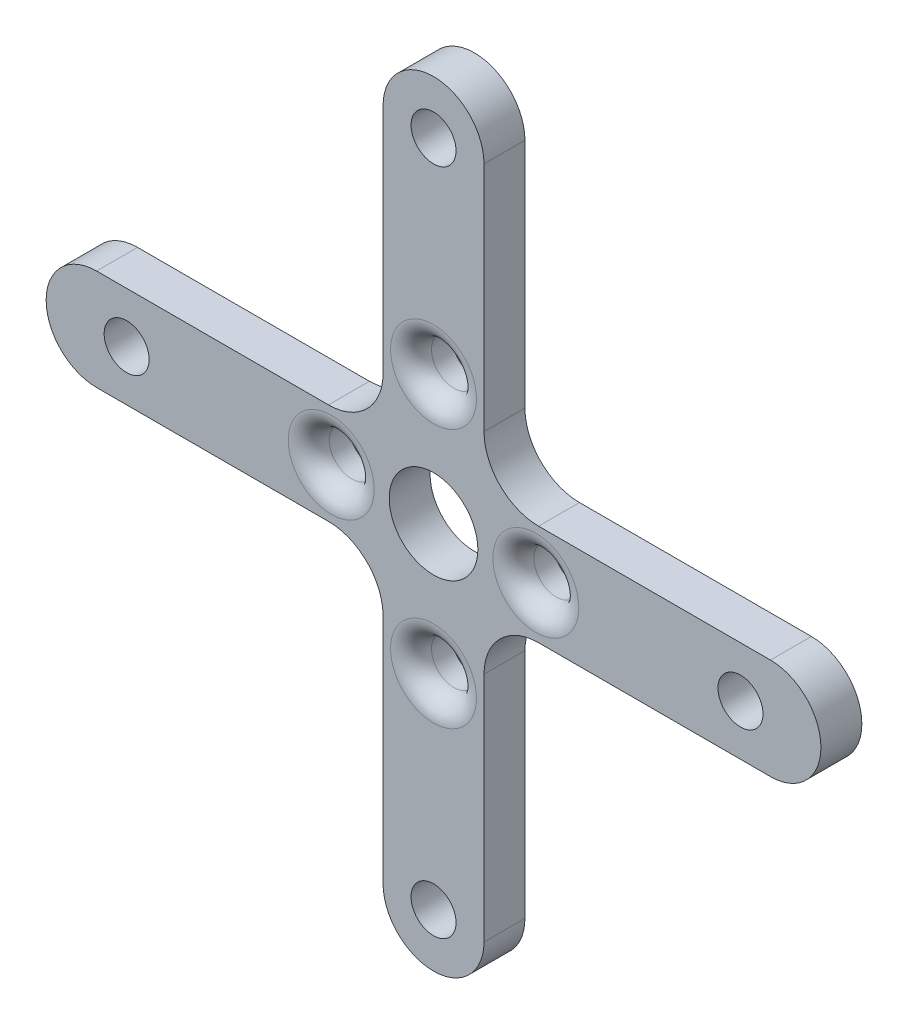
ISO-10303-21;
HEADER;
FILE_DESCRIPTION(('STEP AP214'),'2;1');
FILE_NAME('part.step','',(''),(''),'','','');
FILE_SCHEMA(('AUTOMOTIVE_DESIGN { 1 0 10303 214 1 1 1 1 }'));
ENDSEC;
DATA;
#1=APPLICATION_CONTEXT('core data for automotive mechanical design processes');
#2=APPLICATION_PROTOCOL_DEFINITION('international standard','automotive_design',2000,#1);
#3=PRODUCT_CONTEXT('',#1,'mechanical');
#4=PRODUCT('Part','Part','',(#3));
#5=PRODUCT_RELATED_PRODUCT_CATEGORY('part','',(#4));
#6=PRODUCT_DEFINITION_FORMATION('','',#4);
#7=PRODUCT_DEFINITION_CONTEXT('part definition',#1,'design');
#8=PRODUCT_DEFINITION('design','',#6,#7);
#9=PRODUCT_DEFINITION_SHAPE('','',#8);
#10=(LENGTH_UNIT() NAMED_UNIT(*) SI_UNIT(.MILLI.,.METRE.));
#11=(NAMED_UNIT(*) PLANE_ANGLE_UNIT() SI_UNIT($,.RADIAN.));
#12=(NAMED_UNIT(*) SI_UNIT($,.STERADIAN.) SOLID_ANGLE_UNIT());
#13=UNCERTAINTY_MEASURE_WITH_UNIT(LENGTH_MEASURE(1.E-05),#10,'distance_accuracy_value','');
#14=(GEOMETRIC_REPRESENTATION_CONTEXT(3) GLOBAL_UNCERTAINTY_ASSIGNED_CONTEXT((#13)) GLOBAL_UNIT_ASSIGNED_CONTEXT((#10,
#11,#12)) REPRESENTATION_CONTEXT('',''));
#15=CARTESIAN_POINT('',(0.,0.,0.));
#16=DIRECTION('',(0.,0.,1.));
#17=DIRECTION('',(1.,0.,0.));
#18=AXIS2_PLACEMENT_3D('',#15,#16,#17);
#19=CARTESIAN_POINT('',(0.,-9.5,1.5));
#20=DIRECTION('',(0.,0.,1.));
#21=DIRECTION('',(1.,0.,0.));
#22=AXIS2_PLACEMENT_3D('',#19,#20,#21);
#23=TOROIDAL_SURFACE('',#22,3.15,1.5);
#24=CARTESIAN_POINT('',(0.,-9.5,3.));
#25=DIRECTION('',(0.,0.,1.));
#26=DIRECTION('',(1.,0.,0.));
#27=AXIS2_PLACEMENT_3D('',#24,#25,#26);
#28=CIRCLE('',#27,3.15);
#29=CARTESIAN_POINT('',(3.15,-9.5,3.));
#30=VERTEX_POINT('',#29);
#31=EDGE_CURVE('E45',#30,#30,#28,.F.);
#32=ORIENTED_EDGE('',*,*,#31,.F.);
#33=EDGE_LOOP('',(#32));
#34=FACE_BOUND('',#33,.T.);
#35=CARTESIAN_POINT('',(0.,-9.5,1.5));
#36=DIRECTION('',(0.,0.,1.));
#37=DIRECTION('',(1.,0.,0.));
#38=AXIS2_PLACEMENT_3D('',#35,#36,#37);
#39=CIRCLE('',#38,1.65);
#40=CARTESIAN_POINT('',(1.65,-9.5,1.5));
#41=VERTEX_POINT('',#40);
#42=EDGE_CURVE('E11',#41,#41,#39,.T.);
#43=ORIENTED_EDGE('',*,*,#42,.F.);
#44=EDGE_LOOP('',(#43));
#45=FACE_BOUND('',#44,.T.);
#46=ADVANCED_FACE('F37',(#34,#45),#23,.T.);
#47=CARTESIAN_POINT('',(7.5,0.,1.5));
#48=DIRECTION('',(0.,0.,1.));
#49=DIRECTION('',(1.,0.,0.));
#50=AXIS2_PLACEMENT_3D('',#47,#48,#49);
#51=TOROIDAL_SURFACE('',#50,3.15,1.5);
#52=CARTESIAN_POINT('',(7.5,0.,3.));
#53=DIRECTION('',(0.,0.,1.));
#54=DIRECTION('',(1.,0.,0.));
#55=AXIS2_PLACEMENT_3D('',#52,#53,#54);
#56=CIRCLE('',#55,3.15);
#57=CARTESIAN_POINT('',(10.65,0.,3.));
#58=VERTEX_POINT('',#57);
#59=EDGE_CURVE('E269',#58,#58,#56,.F.);
#60=ORIENTED_EDGE('',*,*,#59,.F.);
#61=EDGE_LOOP('',(#60));
#62=FACE_BOUND('',#61,.T.);
#63=CARTESIAN_POINT('',(7.5,0.,1.5));
#64=DIRECTION('',(0.,0.,1.));
#65=DIRECTION('',(1.,0.,0.));
#66=AXIS2_PLACEMENT_3D('',#63,#64,#65);
#67=CIRCLE('',#66,1.65);
#68=CARTESIAN_POINT('',(9.15,0.,1.5));
#69=VERTEX_POINT('',#68);
#70=EDGE_CURVE('E272',#69,#69,#67,.T.);
#71=ORIENTED_EDGE('',*,*,#70,.F.);
#72=EDGE_LOOP('',(#71));
#73=FACE_BOUND('',#72,.T.);
#74=ADVANCED_FACE('F281',(#62,#73),#51,.T.);
#75=CARTESIAN_POINT('',(0.,9.5,1.5));
#76=DIRECTION('',(0.,0.,1.));
#77=DIRECTION('',(1.,0.,0.));
#78=AXIS2_PLACEMENT_3D('',#75,#76,#77);
#79=TOROIDAL_SURFACE('',#78,3.15,1.5);
#80=CARTESIAN_POINT('',(0.,9.5,3.));
#81=DIRECTION('',(0.,0.,1.));
#82=DIRECTION('',(1.,0.,0.));
#83=AXIS2_PLACEMENT_3D('',#80,#81,#82);
#84=CIRCLE('',#83,3.15);
#85=CARTESIAN_POINT('',(3.15,9.5,3.));
#86=VERTEX_POINT('',#85);
#87=EDGE_CURVE('E263',#86,#86,#84,.F.);
#88=ORIENTED_EDGE('',*,*,#87,.F.);
#89=EDGE_LOOP('',(#88));
#90=FACE_BOUND('',#89,.T.);
#91=CARTESIAN_POINT('',(0.,9.5,1.5));
#92=DIRECTION('',(0.,0.,1.));
#93=DIRECTION('',(1.,0.,0.));
#94=AXIS2_PLACEMENT_3D('',#91,#92,#93);
#95=CIRCLE('',#94,1.65);
#96=CARTESIAN_POINT('',(1.65,9.5,1.5));
#97=VERTEX_POINT('',#96);
#98=EDGE_CURVE('E266',#97,#97,#95,.T.);
#99=ORIENTED_EDGE('',*,*,#98,.F.);
#100=EDGE_LOOP('',(#99));
#101=FACE_BOUND('',#100,.T.);
#102=ADVANCED_FACE('F424',(#90,#101),#79,.T.);
#103=CARTESIAN_POINT('',(-7.5,0.,1.5));
#104=DIRECTION('',(0.,0.,1.));
#105=DIRECTION('',(1.,0.,0.));
#106=AXIS2_PLACEMENT_3D('',#103,#104,#105);
#107=TOROIDAL_SURFACE('',#106,3.15,1.5);
#108=CARTESIAN_POINT('',(-7.5,0.,3.));
#109=DIRECTION('',(0.,0.,1.));
#110=DIRECTION('',(1.,0.,0.));
#111=AXIS2_PLACEMENT_3D('',#108,#109,#110);
#112=CIRCLE('',#111,3.15);
#113=CARTESIAN_POINT('',(-4.35,0.,3.));
#114=VERTEX_POINT('',#113);
#115=EDGE_CURVE('E229',#114,#114,#112,.F.);
#116=ORIENTED_EDGE('',*,*,#115,.F.);
#117=EDGE_LOOP('',(#116));
#118=FACE_BOUND('',#117,.T.);
#119=CARTESIAN_POINT('',(-7.5,0.,1.5));
#120=DIRECTION('',(0.,0.,1.));
#121=DIRECTION('',(1.,0.,0.));
#122=AXIS2_PLACEMENT_3D('',#119,#120,#121);
#123=CIRCLE('',#122,1.65);
#124=CARTESIAN_POINT('',(-5.85,0.,1.5));
#125=VERTEX_POINT('',#124);
#126=EDGE_CURVE('E260',#125,#125,#123,.T.);
#127=ORIENTED_EDGE('',*,*,#126,.F.);
#128=EDGE_LOOP('',(#127));
#129=FACE_BOUND('',#128,.T.);
#130=ADVANCED_FACE('F421',(#118,#129),#107,.T.);
#131=CARTESIAN_POINT('',(7.7,-7.7,3.));
#132=DIRECTION('',(0.,0.,-1.));
#133=DIRECTION('',(-1.,0.,0.));
#134=AXIS2_PLACEMENT_3D('',#131,#132,#133);
#135=CYLINDRICAL_SURFACE('',#134,4.);
#136=CARTESIAN_POINT('',(7.7,-7.7,0.));
#137=DIRECTION('',(0.,0.,1.));
#138=DIRECTION('',(1.,0.,0.));
#139=AXIS2_PLACEMENT_3D('',#136,#137,#138);
#140=CIRCLE('',#139,4.);
#141=CARTESIAN_POINT('',(7.7,-3.7,0.));
#142=VERTEX_POINT('',#141);
#143=CARTESIAN_POINT('',(3.7,-7.7,0.));
#144=VERTEX_POINT('',#143);
#145=EDGE_CURVE('E186',#142,#144,#140,.T.);
#146=ORIENTED_EDGE('',*,*,#145,.F.);
#147=DIRECTION('',(0.,0.,-1.));
#148=VECTOR('',#147,1.);
#149=CARTESIAN_POINT('',(7.7,-3.7,3.));
#150=LINE('',#149,#148);
#151=CARTESIAN_POINT('',(7.7,-3.7,3.));
#152=VERTEX_POINT('',#151);
#153=EDGE_CURVE('E53',#152,#142,#150,.T.);
#154=ORIENTED_EDGE('',*,*,#153,.F.);
#155=CARTESIAN_POINT('',(7.7,-7.7,3.));
#156=DIRECTION('',(0.,0.,1.));
#157=DIRECTION('',(1.,0.,0.));
#158=AXIS2_PLACEMENT_3D('',#155,#156,#157);
#159=CIRCLE('',#158,4.);
#160=CARTESIAN_POINT('',(3.7,-7.7,3.));
#161=VERTEX_POINT('',#160);
#162=EDGE_CURVE('E227',#152,#161,#159,.T.);
#163=ORIENTED_EDGE('',*,*,#162,.T.);
#164=DIRECTION('',(0.,0.,-1.));
#165=VECTOR('',#164,1.);
#166=CARTESIAN_POINT('',(3.7,-7.7,3.));
#167=LINE('',#166,#165);
#168=EDGE_CURVE('E115',#161,#144,#167,.T.);
#169=ORIENTED_EDGE('',*,*,#168,.T.);
#170=EDGE_LOOP('',(#146,#154,#163,#169));
#171=FACE_BOUND('',#170,.T.);
#172=ADVANCED_FACE('F382',(#171),#135,.F.);
#173=CARTESIAN_POINT('',(7.7,-3.7,3.));
#174=DIRECTION('',(0.,1.,0.));
#175=DIRECTION('',(0.,0.,1.));
#176=AXIS2_PLACEMENT_3D('',#173,#174,#175);
#177=PLANE('',#176);
#178=DIRECTION('',(1.,0.,0.));
#179=VECTOR('',#178,1.);
#180=CARTESIAN_POINT('',(7.7,-3.7,0.));
#181=LINE('',#180,#179);
#182=CARTESIAN_POINT('',(24.7,-3.7,0.));
#183=VERTEX_POINT('',#182);
#184=EDGE_CURVE('E106',#142,#183,#181,.T.);
#185=ORIENTED_EDGE('',*,*,#184,.T.);
#186=DIRECTION('',(0.,0.,-1.));
#187=VECTOR('',#186,1.);
#188=CARTESIAN_POINT('',(24.7,-3.7,3.));
#189=LINE('',#188,#187);
#190=CARTESIAN_POINT('',(24.7,-3.7,3.));
#191=VERTEX_POINT('',#190);
#192=EDGE_CURVE('E175',#191,#183,#189,.T.);
#193=ORIENTED_EDGE('',*,*,#192,.F.);
#194=DIRECTION('',(1.,0.,0.));
#195=VECTOR('',#194,1.);
#196=CARTESIAN_POINT('',(7.7,-3.7,3.));
#197=LINE('',#196,#195);
#198=EDGE_CURVE('E164',#152,#191,#197,.T.);
#199=ORIENTED_EDGE('',*,*,#198,.F.);
#200=ORIENTED_EDGE('',*,*,#153,.T.);
#201=EDGE_LOOP('',(#185,#193,#199,#200));
#202=FACE_BOUND('',#201,.T.);
#203=ADVANCED_FACE('F420',(#202),#177,.F.);
#204=CARTESIAN_POINT('',(24.7,0.,3.));
#205=DIRECTION('',(0.,0.,-1.));
#206=DIRECTION('',(-1.,0.,0.));
#207=AXIS2_PLACEMENT_3D('',#204,#205,#206);
#208=CYLINDRICAL_SURFACE('',#207,3.7);
#209=CARTESIAN_POINT('',(24.7,0.,0.));
#210=DIRECTION('',(0.,0.,1.));
#211=DIRECTION('',(1.,0.,0.));
#212=AXIS2_PLACEMENT_3D('',#209,#210,#211);
#213=CIRCLE('',#212,3.7);
#214=CARTESIAN_POINT('',(24.7,3.7,0.));
#215=VERTEX_POINT('',#214);
#216=EDGE_CURVE('E171',#183,#215,#213,.T.);
#217=ORIENTED_EDGE('',*,*,#216,.T.);
#218=DIRECTION('',(0.,0.,-1.));
#219=VECTOR('',#218,1.);
#220=CARTESIAN_POINT('',(24.7,3.7,3.));
#221=LINE('',#220,#219);
#222=CARTESIAN_POINT('',(24.7,3.7,3.));
#223=VERTEX_POINT('',#222);
#224=EDGE_CURVE('E168',#223,#215,#221,.T.);
#225=ORIENTED_EDGE('',*,*,#224,.F.);
#226=CARTESIAN_POINT('',(24.7,0.,3.));
#227=DIRECTION('',(0.,0.,1.));
#228=DIRECTION('',(1.,0.,0.));
#229=AXIS2_PLACEMENT_3D('',#226,#227,#228);
#230=CIRCLE('',#229,3.7);
#231=EDGE_CURVE('E156',#191,#223,#230,.T.);
#232=ORIENTED_EDGE('',*,*,#231,.F.);
#233=ORIENTED_EDGE('',*,*,#192,.T.);
#234=EDGE_LOOP('',(#217,#225,#232,#233));
#235=FACE_BOUND('',#234,.T.);
#236=ADVANCED_FACE('F169',(#235),#208,.T.);
#237=CARTESIAN_POINT('',(7.7,3.7,3.));
#238=DIRECTION('',(0.,1.,0.));
#239=DIRECTION('',(0.,0.,1.));
#240=AXIS2_PLACEMENT_3D('',#237,#238,#239);
#241=PLANE('',#240);
#242=DIRECTION('',(1.,0.,0.));
#243=VECTOR('',#242,1.);
#244=CARTESIAN_POINT('',(7.7,3.7,0.));
#245=LINE('',#244,#243);
#246=CARTESIAN_POINT('',(7.7,3.7,0.));
#247=VERTEX_POINT('',#246);
#248=EDGE_CURVE('E223',#247,#215,#245,.T.);
#249=ORIENTED_EDGE('',*,*,#248,.F.);
#250=DIRECTION('',(0.,0.,-1.));
#251=VECTOR('',#250,1.);
#252=CARTESIAN_POINT('',(7.7,3.7,3.));
#253=LINE('',#252,#251);
#254=CARTESIAN_POINT('',(7.7,3.7,3.));
#255=VERTEX_POINT('',#254);
#256=EDGE_CURVE('E176',#255,#247,#253,.T.);
#257=ORIENTED_EDGE('',*,*,#256,.F.);
#258=DIRECTION('',(1.,0.,0.));
#259=VECTOR('',#258,1.);
#260=CARTESIAN_POINT('',(7.7,3.7,3.));
#261=LINE('',#260,#259);
#262=EDGE_CURVE('E162',#255,#223,#261,.T.);
#263=ORIENTED_EDGE('',*,*,#262,.T.);
#264=ORIENTED_EDGE('',*,*,#224,.T.);
#265=EDGE_LOOP('',(#249,#257,#263,#264));
#266=FACE_BOUND('',#265,.T.);
#267=ADVANCED_FACE('F178',(#266),#241,.T.);
#268=CARTESIAN_POINT('',(7.7,7.7,3.));
#269=DIRECTION('',(0.,0.,-1.));
#270=DIRECTION('',(-1.,0.,0.));
#271=AXIS2_PLACEMENT_3D('',#268,#269,#270);
#272=CYLINDRICAL_SURFACE('',#271,4.);
#273=CARTESIAN_POINT('',(7.7,7.7,0.));
#274=DIRECTION('',(0.,0.,1.));
#275=DIRECTION('',(1.,0.,0.));
#276=AXIS2_PLACEMENT_3D('',#273,#274,#275);
#277=CIRCLE('',#276,4.);
#278=CARTESIAN_POINT('',(3.7,7.7,0.));
#279=VERTEX_POINT('',#278);
#280=EDGE_CURVE('E220',#279,#247,#277,.T.);
#281=ORIENTED_EDGE('',*,*,#280,.F.);
#282=DIRECTION('',(0.,0.,-1.));
#283=VECTOR('',#282,1.);
#284=CARTESIAN_POINT('',(3.7,7.7,3.));
#285=LINE('',#284,#283);
#286=CARTESIAN_POINT('',(3.7,7.7,3.));
#287=VERTEX_POINT('',#286);
#288=EDGE_CURVE('E232',#287,#279,#285,.T.);
#289=ORIENTED_EDGE('',*,*,#288,.F.);
#290=CARTESIAN_POINT('',(7.7,7.7,3.));
#291=DIRECTION('',(0.,0.,1.));
#292=DIRECTION('',(1.,0.,0.));
#293=AXIS2_PLACEMENT_3D('',#290,#291,#292);
#294=CIRCLE('',#293,4.);
#295=EDGE_CURVE('E179',#287,#255,#294,.T.);
#296=ORIENTED_EDGE('',*,*,#295,.T.);
#297=ORIENTED_EDGE('',*,*,#256,.T.);
#298=EDGE_LOOP('',(#281,#289,#296,#297));
#299=FACE_BOUND('',#298,.T.);
#300=ADVANCED_FACE('F387',(#299),#272,.F.);
#301=CARTESIAN_POINT('',(3.7,7.7,3.));
#302=DIRECTION('',(-1.,0.,0.));
#303=DIRECTION('',(0.,0.,1.));
#304=AXIS2_PLACEMENT_3D('',#301,#302,#303);
#305=PLANE('',#304);
#306=DIRECTION('',(0.,1.,0.));
#307=VECTOR('',#306,1.);
#308=CARTESIAN_POINT('',(3.7,7.7,0.));
#309=LINE('',#308,#307);
#310=CARTESIAN_POINT('',(3.7,24.7,0.));
#311=VERTEX_POINT('',#310);
#312=EDGE_CURVE('E218',#279,#311,#309,.T.);
#313=ORIENTED_EDGE('',*,*,#312,.T.);
#314=DIRECTION('',(0.,0.,-1.));
#315=VECTOR('',#314,1.);
#316=CARTESIAN_POINT('',(3.7,24.7,3.));
#317=LINE('',#316,#315);
#318=CARTESIAN_POINT('',(3.7,24.7,3.));
#319=VERTEX_POINT('',#318);
#320=EDGE_CURVE('E234',#319,#311,#317,.T.);
#321=ORIENTED_EDGE('',*,*,#320,.F.);
#322=DIRECTION('',(0.,1.,0.));
#323=VECTOR('',#322,1.);
#324=CARTESIAN_POINT('',(3.7,7.7,3.));
#325=LINE('',#324,#323);
#326=EDGE_CURVE('E181',#287,#319,#325,.T.);
#327=ORIENTED_EDGE('',*,*,#326,.F.);
#328=ORIENTED_EDGE('',*,*,#288,.T.);
#329=EDGE_LOOP('',(#313,#321,#327,#328));
#330=FACE_BOUND('',#329,.T.);
#331=ADVANCED_FACE('F341',(#330),#305,.F.);
#332=CARTESIAN_POINT('',(0.,24.7,3.));
#333=DIRECTION('',(0.,0.,-1.));
#334=DIRECTION('',(-1.,0.,0.));
#335=AXIS2_PLACEMENT_3D('',#332,#333,#334);
#336=CYLINDRICAL_SURFACE('',#335,3.7);
#337=CARTESIAN_POINT('',(0.,24.7,0.));
#338=DIRECTION('',(0.,0.,1.));
#339=DIRECTION('',(1.,0.,0.));
#340=AXIS2_PLACEMENT_3D('',#337,#338,#339);
#341=CIRCLE('',#340,3.7);
#342=CARTESIAN_POINT('',(-3.7,24.7,0.));
#343=VERTEX_POINT('',#342);
#344=EDGE_CURVE('E215',#311,#343,#341,.T.);
#345=ORIENTED_EDGE('',*,*,#344,.T.);
#346=DIRECTION('',(0.,0.,-1.));
#347=VECTOR('',#346,1.);
#348=CARTESIAN_POINT('',(-3.7,24.7,3.));
#349=LINE('',#348,#347);
#350=CARTESIAN_POINT('',(-3.7,24.7,3.));
#351=VERTEX_POINT('',#350);
#352=EDGE_CURVE('E237',#351,#343,#349,.T.);
#353=ORIENTED_EDGE('',*,*,#352,.F.);
#354=CARTESIAN_POINT('',(0.,24.7,3.));
#355=DIRECTION('',(0.,0.,1.));
#356=DIRECTION('',(1.,0.,0.));
#357=AXIS2_PLACEMENT_3D('',#354,#355,#356);
#358=CIRCLE('',#357,3.7);
#359=EDGE_CURVE('E334',#319,#351,#358,.T.);
#360=ORIENTED_EDGE('',*,*,#359,.F.);
#361=ORIENTED_EDGE('',*,*,#320,.T.);
#362=EDGE_LOOP('',(#345,#353,#360,#361));
#363=FACE_BOUND('',#362,.T.);
#364=ADVANCED_FACE('F345',(#363),#336,.T.);
#365=CARTESIAN_POINT('',(-3.7,7.7,3.));
#366=DIRECTION('',(-1.,0.,0.));
#367=DIRECTION('',(0.,0.,1.));
#368=AXIS2_PLACEMENT_3D('',#365,#366,#367);
#369=PLANE('',#368);
#370=DIRECTION('',(0.,1.,0.));
#371=VECTOR('',#370,1.);
#372=CARTESIAN_POINT('',(-3.7,7.7,0.));
#373=LINE('',#372,#371);
#374=CARTESIAN_POINT('',(-3.7,7.7,0.));
#375=VERTEX_POINT('',#374);
#376=EDGE_CURVE('E212',#375,#343,#373,.T.);
#377=ORIENTED_EDGE('',*,*,#376,.F.);
#378=DIRECTION('',(0.,0.,-1.));
#379=VECTOR('',#378,1.);
#380=CARTESIAN_POINT('',(-3.7,7.7,3.));
#381=LINE('',#380,#379);
#382=CARTESIAN_POINT('',(-3.7,7.7,3.));
#383=VERTEX_POINT('',#382);
#384=EDGE_CURVE('E239',#383,#375,#381,.T.);
#385=ORIENTED_EDGE('',*,*,#384,.F.);
#386=DIRECTION('',(0.,1.,0.));
#387=VECTOR('',#386,1.);
#388=CARTESIAN_POINT('',(-3.7,7.7,3.));
#389=LINE('',#388,#387);
#390=EDGE_CURVE('E331',#383,#351,#389,.T.);
#391=ORIENTED_EDGE('',*,*,#390,.T.);
#392=ORIENTED_EDGE('',*,*,#352,.T.);
#393=EDGE_LOOP('',(#377,#385,#391,#392));
#394=FACE_BOUND('',#393,.T.);
#395=ADVANCED_FACE('F348',(#394),#369,.T.);
#396=CARTESIAN_POINT('',(-7.7,7.7,3.));
#397=DIRECTION('',(0.,0.,-1.));
#398=DIRECTION('',(-1.,0.,0.));
#399=AXIS2_PLACEMENT_3D('',#396,#397,#398);
#400=CYLINDRICAL_SURFACE('',#399,4.);
#401=CARTESIAN_POINT('',(-7.7,7.7,0.));
#402=DIRECTION('',(0.,0.,1.));
#403=DIRECTION('',(1.,0.,0.));
#404=AXIS2_PLACEMENT_3D('',#401,#402,#403);
#405=CIRCLE('',#404,4.);
#406=CARTESIAN_POINT('',(-7.7,3.7,0.));
#407=VERTEX_POINT('',#406);
#408=EDGE_CURVE('E209',#407,#375,#405,.T.);
#409=ORIENTED_EDGE('',*,*,#408,.F.);
#410=DIRECTION('',(0.,0.,-1.));
#411=VECTOR('',#410,1.);
#412=CARTESIAN_POINT('',(-7.7,3.7,3.));
#413=LINE('',#412,#411);
#414=CARTESIAN_POINT('',(-7.7,3.7,3.));
#415=VERTEX_POINT('',#414);
#416=EDGE_CURVE('E241',#415,#407,#413,.T.);
#417=ORIENTED_EDGE('',*,*,#416,.F.);
#418=CARTESIAN_POINT('',(-7.7,7.7,3.));
#419=DIRECTION('',(0.,0.,1.));
#420=DIRECTION('',(1.,0.,0.));
#421=AXIS2_PLACEMENT_3D('',#418,#419,#420);
#422=CIRCLE('',#421,4.);
#423=EDGE_CURVE('E328',#415,#383,#422,.T.);
#424=ORIENTED_EDGE('',*,*,#423,.T.);
#425=ORIENTED_EDGE('',*,*,#384,.T.);
#426=EDGE_LOOP('',(#409,#417,#424,#425));
#427=FACE_BOUND('',#426,.T.);
#428=ADVANCED_FACE('F352',(#427),#400,.F.);
#429=CARTESIAN_POINT('',(-7.7,3.7,3.));
#430=DIRECTION('',(0.,-1.,0.));
#431=DIRECTION('',(1.,0.,0.));
#432=AXIS2_PLACEMENT_3D('',#429,#430,#431);
#433=PLANE('',#432);
#434=DIRECTION('',(-1.,0.,0.));
#435=VECTOR('',#434,1.);
#436=CARTESIAN_POINT('',(-7.7,3.7,0.));
#437=LINE('',#436,#435);
#438=CARTESIAN_POINT('',(-24.7,3.7,0.));
#439=VERTEX_POINT('',#438);
#440=EDGE_CURVE('E207',#407,#439,#437,.T.);
#441=ORIENTED_EDGE('',*,*,#440,.T.);
#442=DIRECTION('',(0.,0.,-1.));
#443=VECTOR('',#442,1.);
#444=CARTESIAN_POINT('',(-24.7,3.7,3.));
#445=LINE('',#444,#443);
#446=CARTESIAN_POINT('',(-24.7,3.7,3.));
#447=VERTEX_POINT('',#446);
#448=EDGE_CURVE('E243',#447,#439,#445,.T.);
#449=ORIENTED_EDGE('',*,*,#448,.F.);
#450=DIRECTION('',(-1.,0.,0.));
#451=VECTOR('',#450,1.);
#452=CARTESIAN_POINT('',(-7.7,3.7,3.));
#453=LINE('',#452,#451);
#454=EDGE_CURVE('E326',#415,#447,#453,.T.);
#455=ORIENTED_EDGE('',*,*,#454,.F.);
#456=ORIENTED_EDGE('',*,*,#416,.T.);
#457=EDGE_LOOP('',(#441,#449,#455,#456));
#458=FACE_BOUND('',#457,.T.);
#459=ADVANCED_FACE('F357',(#458),#433,.F.);
#460=CARTESIAN_POINT('',(-24.7,0.,3.));
#461=DIRECTION('',(0.,0.,-1.));
#462=DIRECTION('',(-1.,0.,0.));
#463=AXIS2_PLACEMENT_3D('',#460,#461,#462);
#464=CYLINDRICAL_SURFACE('',#463,3.7);
#465=CARTESIAN_POINT('',(-24.7,0.,0.));
#466=DIRECTION('',(0.,0.,1.));
#467=DIRECTION('',(1.,0.,0.));
#468=AXIS2_PLACEMENT_3D('',#465,#466,#467);
#469=CIRCLE('',#468,3.7);
#470=CARTESIAN_POINT('',(-24.7,-3.7,0.));
#471=VERTEX_POINT('',#470);
#472=EDGE_CURVE('E204',#439,#471,#469,.T.);
#473=ORIENTED_EDGE('',*,*,#472,.T.);
#474=DIRECTION('',(0.,0.,-1.));
#475=VECTOR('',#474,1.);
#476=CARTESIAN_POINT('',(-24.7,-3.7,3.));
#477=LINE('',#476,#475);
#478=CARTESIAN_POINT('',(-24.7,-3.7,3.));
#479=VERTEX_POINT('',#478);
#480=EDGE_CURVE('E246',#479,#471,#477,.T.);
#481=ORIENTED_EDGE('',*,*,#480,.F.);
#482=CARTESIAN_POINT('',(-24.7,0.,3.));
#483=DIRECTION('',(0.,0.,1.));
#484=DIRECTION('',(1.,0.,0.));
#485=AXIS2_PLACEMENT_3D('',#482,#483,#484);
#486=CIRCLE('',#485,3.7);
#487=EDGE_CURVE('E324',#447,#479,#486,.T.);
#488=ORIENTED_EDGE('',*,*,#487,.F.);
#489=ORIENTED_EDGE('',*,*,#448,.T.);
#490=EDGE_LOOP('',(#473,#481,#488,#489));
#491=FACE_BOUND('',#490,.T.);
#492=ADVANCED_FACE('F363',(#491),#464,.T.);
#493=CARTESIAN_POINT('',(-7.7,-3.7,3.));
#494=DIRECTION('',(0.,-1.,0.));
#495=DIRECTION('',(0.,0.,-1.));
#496=AXIS2_PLACEMENT_3D('',#493,#494,#495);
#497=PLANE('',#496);
#498=DIRECTION('',(-1.,0.,0.));
#499=VECTOR('',#498,1.);
#500=CARTESIAN_POINT('',(-7.7,-3.7,0.));
#501=LINE('',#500,#499);
#502=CARTESIAN_POINT('',(-7.7,-3.7,0.));
#503=VERTEX_POINT('',#502);
#504=EDGE_CURVE('E201',#503,#471,#501,.T.);
#505=ORIENTED_EDGE('',*,*,#504,.F.);
#506=DIRECTION('',(0.,0.,-1.));
#507=VECTOR('',#506,1.);
#508=CARTESIAN_POINT('',(-7.7,-3.7,3.));
#509=LINE('',#508,#507);
#510=CARTESIAN_POINT('',(-7.7,-3.7,3.));
#511=VERTEX_POINT('',#510);
#512=EDGE_CURVE('E248',#511,#503,#509,.T.);
#513=ORIENTED_EDGE('',*,*,#512,.F.);
#514=DIRECTION('',(-1.,0.,0.));
#515=VECTOR('',#514,1.);
#516=CARTESIAN_POINT('',(-7.7,-3.7,3.));
#517=LINE('',#516,#515);
#518=EDGE_CURVE('E321',#511,#479,#517,.T.);
#519=ORIENTED_EDGE('',*,*,#518,.T.);
#520=ORIENTED_EDGE('',*,*,#480,.T.);
#521=EDGE_LOOP('',(#505,#513,#519,#520));
#522=FACE_BOUND('',#521,.T.);
#523=ADVANCED_FACE('F367',(#522),#497,.T.);
#524=CARTESIAN_POINT('',(-7.7,-7.7,3.));
#525=DIRECTION('',(0.,0.,-1.));
#526=DIRECTION('',(-1.,0.,0.));
#527=AXIS2_PLACEMENT_3D('',#524,#525,#526);
#528=CYLINDRICAL_SURFACE('',#527,4.);
#529=CARTESIAN_POINT('',(-7.7,-7.7,0.));
#530=DIRECTION('',(0.,0.,1.));
#531=DIRECTION('',(1.,0.,0.));
#532=AXIS2_PLACEMENT_3D('',#529,#530,#531);
#533=CIRCLE('',#532,4.);
#534=CARTESIAN_POINT('',(-3.7,-7.7,0.));
#535=VERTEX_POINT('',#534);
#536=EDGE_CURVE('E198',#535,#503,#533,.T.);
#537=ORIENTED_EDGE('',*,*,#536,.F.);
#538=DIRECTION('',(0.,0.,-1.));
#539=VECTOR('',#538,1.);
#540=CARTESIAN_POINT('',(-3.7,-7.7,3.));
#541=LINE('',#540,#539);
#542=CARTESIAN_POINT('',(-3.7,-7.7,3.));
#543=VERTEX_POINT('',#542);
#544=EDGE_CURVE('E250',#543,#535,#541,.T.);
#545=ORIENTED_EDGE('',*,*,#544,.F.);
#546=CARTESIAN_POINT('',(-7.7,-7.7,3.));
#547=DIRECTION('',(0.,0.,1.));
#548=DIRECTION('',(1.,0.,0.));
#549=AXIS2_PLACEMENT_3D('',#546,#547,#548);
#550=CIRCLE('',#549,4.);
#551=EDGE_CURVE('E318',#543,#511,#550,.T.);
#552=ORIENTED_EDGE('',*,*,#551,.T.);
#553=ORIENTED_EDGE('',*,*,#512,.T.);
#554=EDGE_LOOP('',(#537,#545,#552,#553));
#555=FACE_BOUND('',#554,.T.);
#556=ADVANCED_FACE('F370',(#555),#528,.F.);
#557=CARTESIAN_POINT('',(-3.7,-7.7,3.));
#558=DIRECTION('',(1.,0.,0.));
#559=DIRECTION('',(0.,1.,0.));
#560=AXIS2_PLACEMENT_3D('',#557,#558,#559);
#561=PLANE('',#560);
#562=DIRECTION('',(0.,-1.,0.));
#563=VECTOR('',#562,1.);
#564=CARTESIAN_POINT('',(-3.7,-7.7,0.));
#565=LINE('',#564,#563);
#566=CARTESIAN_POINT('',(-3.7,-24.7,0.));
#567=VERTEX_POINT('',#566);
#568=EDGE_CURVE('E196',#535,#567,#565,.T.);
#569=ORIENTED_EDGE('',*,*,#568,.T.);
#570=DIRECTION('',(0.,0.,-1.));
#571=VECTOR('',#570,1.);
#572=CARTESIAN_POINT('',(-3.7,-24.7,3.));
#573=LINE('',#572,#571);
#574=CARTESIAN_POINT('',(-3.7,-24.7,3.));
#575=VERTEX_POINT('',#574);
#576=EDGE_CURVE('E252',#575,#567,#573,.T.);
#577=ORIENTED_EDGE('',*,*,#576,.F.);
#578=DIRECTION('',(0.,-1.,0.));
#579=VECTOR('',#578,1.);
#580=CARTESIAN_POINT('',(-3.7,-7.7,3.));
#581=LINE('',#580,#579);
#582=EDGE_CURVE('E316',#543,#575,#581,.T.);
#583=ORIENTED_EDGE('',*,*,#582,.F.);
#584=ORIENTED_EDGE('',*,*,#544,.T.);
#585=EDGE_LOOP('',(#569,#577,#583,#584));
#586=FACE_BOUND('',#585,.T.);
#587=ADVANCED_FACE('F376',(#586),#561,.F.);
#588=CARTESIAN_POINT('',(0.,-24.7,3.));
#589=DIRECTION('',(0.,0.,-1.));
#590=DIRECTION('',(-1.,0.,0.));
#591=AXIS2_PLACEMENT_3D('',#588,#589,#590);
#592=CYLINDRICAL_SURFACE('',#591,3.7);
#593=CARTESIAN_POINT('',(0.,-24.7,0.));
#594=DIRECTION('',(0.,0.,1.));
#595=DIRECTION('',(1.,0.,0.));
#596=AXIS2_PLACEMENT_3D('',#593,#594,#595);
#597=CIRCLE('',#596,3.7);
#598=CARTESIAN_POINT('',(3.7,-24.7,0.));
#599=VERTEX_POINT('',#598);
#600=EDGE_CURVE('E193',#567,#599,#597,.T.);
#601=ORIENTED_EDGE('',*,*,#600,.T.);
#602=DIRECTION('',(0.,0.,-1.));
#603=VECTOR('',#602,1.);
#604=CARTESIAN_POINT('',(3.7,-24.7,3.));
#605=LINE('',#604,#603);
#606=CARTESIAN_POINT('',(3.7,-24.7,3.));
#607=VERTEX_POINT('',#606);
#608=EDGE_CURVE('E255',#607,#599,#605,.T.);
#609=ORIENTED_EDGE('',*,*,#608,.F.);
#610=CARTESIAN_POINT('',(0.,-24.7,3.));
#611=DIRECTION('',(0.,0.,1.));
#612=DIRECTION('',(1.,0.,0.));
#613=AXIS2_PLACEMENT_3D('',#610,#611,#612);
#614=CIRCLE('',#613,3.7);
#615=EDGE_CURVE('E314',#575,#607,#614,.T.);
#616=ORIENTED_EDGE('',*,*,#615,.F.);
#617=ORIENTED_EDGE('',*,*,#576,.T.);
#618=EDGE_LOOP('',(#601,#609,#616,#617));
#619=FACE_BOUND('',#618,.T.);
#620=ADVANCED_FACE('F380',(#619),#592,.T.);
#621=CARTESIAN_POINT('',(3.7,-7.7,3.));
#622=DIRECTION('',(1.,0.,0.));
#623=DIRECTION('',(0.,0.,-1.));
#624=AXIS2_PLACEMENT_3D('',#621,#622,#623);
#625=PLANE('',#624);
#626=DIRECTION('',(0.,-1.,0.));
#627=VECTOR('',#626,1.);
#628=CARTESIAN_POINT('',(3.7,-7.7,0.));
#629=LINE('',#628,#627);
#630=EDGE_CURVE('E189',#144,#599,#629,.T.);
#631=ORIENTED_EDGE('',*,*,#630,.F.);
#632=ORIENTED_EDGE('',*,*,#168,.F.);
#633=DIRECTION('',(0.,-1.,0.));
#634=VECTOR('',#633,1.);
#635=CARTESIAN_POINT('',(3.7,-7.7,3.));
#636=LINE('',#635,#634);
#637=EDGE_CURVE('E312',#161,#607,#636,.T.);
#638=ORIENTED_EDGE('',*,*,#637,.T.);
#639=ORIENTED_EDGE('',*,*,#608,.T.);
#640=EDGE_LOOP('',(#631,#632,#638,#639));
#641=FACE_BOUND('',#640,.T.);
#642=ADVANCED_FACE('F381',(#641),#625,.T.);
#643=CARTESIAN_POINT('',(7.7,-7.7,3.));
#644=DIRECTION('',(0.,0.,1.));
#645=DIRECTION('',(1.,0.,0.));
#646=AXIS2_PLACEMENT_3D('',#643,#644,#645);
#647=PLANE('',#646);
#648=ORIENTED_EDGE('',*,*,#31,.T.);
#649=EDGE_LOOP('',(#648));
#650=FACE_BOUND('',#649,.T.);
#651=ORIENTED_EDGE('',*,*,#59,.T.);
#652=EDGE_LOOP('',(#651));
#653=FACE_BOUND('',#652,.T.);
#654=ORIENTED_EDGE('',*,*,#87,.T.);
#655=EDGE_LOOP('',(#654));
#656=FACE_BOUND('',#655,.T.);
#657=ORIENTED_EDGE('',*,*,#115,.T.);
#658=EDGE_LOOP('',(#657));
#659=FACE_BOUND('',#658,.T.);
#660=CARTESIAN_POINT('',(-22.5,0.,3.));
#661=DIRECTION('',(0.,0.,1.));
#662=DIRECTION('',(1.,0.,0.));
#663=AXIS2_PLACEMENT_3D('',#660,#661,#662);
#664=CIRCLE('',#663,1.65);
#665=CARTESIAN_POINT('',(-20.85,0.,3.));
#666=VERTEX_POINT('',#665);
#667=EDGE_CURVE('E294',#666,#666,#664,.T.);
#668=ORIENTED_EDGE('',*,*,#667,.F.);
#669=EDGE_LOOP('',(#668));
#670=FACE_BOUND('',#669,.T.);
#671=CARTESIAN_POINT('',(0.,24.5,3.));
#672=DIRECTION('',(0.,0.,1.));
#673=DIRECTION('',(1.,0.,0.));
#674=AXIS2_PLACEMENT_3D('',#671,#672,#673);
#675=CIRCLE('',#674,1.65);
#676=CARTESIAN_POINT('',(1.65,24.5,3.));
#677=VERTEX_POINT('',#676);
#678=EDGE_CURVE('E669',#677,#677,#675,.T.);
#679=ORIENTED_EDGE('',*,*,#678,.F.);
#680=EDGE_LOOP('',(#679));
#681=FACE_BOUND('',#680,.T.);
#682=CARTESIAN_POINT('',(22.5,0.,3.));
#683=DIRECTION('',(0.,0.,1.));
#684=DIRECTION('',(1.,0.,0.));
#685=AXIS2_PLACEMENT_3D('',#682,#683,#684);
#686=CIRCLE('',#685,1.65);
#687=CARTESIAN_POINT('',(24.15,0.,3.));
#688=VERTEX_POINT('',#687);
#689=EDGE_CURVE('E675',#688,#688,#686,.T.);
#690=ORIENTED_EDGE('',*,*,#689,.F.);
#691=EDGE_LOOP('',(#690));
#692=FACE_BOUND('',#691,.T.);
#693=CARTESIAN_POINT('',(0.,-24.5,3.));
#694=DIRECTION('',(0.,0.,1.));
#695=DIRECTION('',(1.,0.,0.));
#696=AXIS2_PLACEMENT_3D('',#693,#694,#695);
#697=CIRCLE('',#696,1.65);
#698=CARTESIAN_POINT('',(1.65,-24.5,3.));
#699=VERTEX_POINT('',#698);
#700=EDGE_CURVE('E679',#699,#699,#697,.T.);
#701=ORIENTED_EDGE('',*,*,#700,.F.);
#702=EDGE_LOOP('',(#701));
#703=FACE_BOUND('',#702,.T.);
#704=CARTESIAN_POINT('',(0.,0.,3.));
#705=DIRECTION('',(0.,0.,1.));
#706=DIRECTION('',(1.,0.,0.));
#707=AXIS2_PLACEMENT_3D('',#704,#705,#706);
#708=CIRCLE('',#707,3.25);
#709=CARTESIAN_POINT('',(3.25,0.,3.));
#710=VERTEX_POINT('',#709);
#711=EDGE_CURVE('E307',#710,#710,#708,.T.);
#712=ORIENTED_EDGE('',*,*,#711,.F.);
#713=EDGE_LOOP('',(#712));
#714=FACE_BOUND('',#713,.T.);
#715=ORIENTED_EDGE('',*,*,#162,.F.);
#716=ORIENTED_EDGE('',*,*,#198,.T.);
#717=ORIENTED_EDGE('',*,*,#231,.T.);
#718=ORIENTED_EDGE('',*,*,#262,.F.);
#719=ORIENTED_EDGE('',*,*,#295,.F.);
#720=ORIENTED_EDGE('',*,*,#326,.T.);
#721=ORIENTED_EDGE('',*,*,#359,.T.);
#722=ORIENTED_EDGE('',*,*,#390,.F.);
#723=ORIENTED_EDGE('',*,*,#423,.F.);
#724=ORIENTED_EDGE('',*,*,#454,.T.);
#725=ORIENTED_EDGE('',*,*,#487,.T.);
#726=ORIENTED_EDGE('',*,*,#518,.F.);
#727=ORIENTED_EDGE('',*,*,#551,.F.);
#728=ORIENTED_EDGE('',*,*,#582,.T.);
#729=ORIENTED_EDGE('',*,*,#615,.T.);
#730=ORIENTED_EDGE('',*,*,#637,.F.);
#731=EDGE_LOOP('',(#715,#716,#717,#718,#719,#720,#721,#722,#723,#724,#725,#726,#727,#728,#729,#730));
#732=FACE_BOUND('',#731,.T.);
#733=ADVANCED_FACE('F159',(#650,#653,#656,#659,#670,#681,#692,#703,#714,#732),#647,.T.);
#734=CARTESIAN_POINT('',(7.7,-7.7,0.));
#735=DIRECTION('',(0.,0.,1.));
#736=DIRECTION('',(1.,0.,0.));
#737=AXIS2_PLACEMENT_3D('',#734,#735,#736);
#738=PLANE('',#737);
#739=CARTESIAN_POINT('',(-7.5,0.,0.));
#740=DIRECTION('',(0.,0.,1.));
#741=DIRECTION('',(1.,0.,0.));
#742=AXIS2_PLACEMENT_3D('',#739,#740,#741);
#743=CIRCLE('',#742,1.65);
#744=CARTESIAN_POINT('',(-5.85,0.,0.));
#745=VERTEX_POINT('',#744);
#746=EDGE_CURVE('E310',#745,#745,#743,.T.);
#747=ORIENTED_EDGE('',*,*,#746,.T.);
#748=EDGE_LOOP('',(#747));
#749=FACE_BOUND('',#748,.T.);
#750=CARTESIAN_POINT('',(-22.5,0.,0.));
#751=DIRECTION('',(0.,0.,1.));
#752=DIRECTION('',(1.,0.,0.));
#753=AXIS2_PLACEMENT_3D('',#750,#751,#752);
#754=CIRCLE('',#753,1.65);
#755=CARTESIAN_POINT('',(-20.85,0.,0.));
#756=VERTEX_POINT('',#755);
#757=EDGE_CURVE('E298',#756,#756,#754,.T.);
#758=ORIENTED_EDGE('',*,*,#757,.T.);
#759=EDGE_LOOP('',(#758));
#760=FACE_BOUND('',#759,.T.);
#761=CARTESIAN_POINT('',(0.,-9.5,0.));
#762=DIRECTION('',(0.,0.,1.));
#763=DIRECTION('',(1.,0.,0.));
#764=AXIS2_PLACEMENT_3D('',#761,#762,#763);
#765=CIRCLE('',#764,1.65);
#766=CARTESIAN_POINT('',(1.65,-9.5,0.));
#767=VERTEX_POINT('',#766);
#768=EDGE_CURVE('E292',#767,#767,#765,.T.);
#769=ORIENTED_EDGE('',*,*,#768,.T.);
#770=EDGE_LOOP('',(#769));
#771=FACE_BOUND('',#770,.T.);
#772=CARTESIAN_POINT('',(7.5,0.,0.));
#773=DIRECTION('',(0.,0.,1.));
#774=DIRECTION('',(1.,0.,0.));
#775=AXIS2_PLACEMENT_3D('',#772,#773,#774);
#776=CIRCLE('',#775,1.65);
#777=CARTESIAN_POINT('',(9.15,0.,0.));
#778=VERTEX_POINT('',#777);
#779=EDGE_CURVE('E295',#778,#778,#776,.T.);
#780=ORIENTED_EDGE('',*,*,#779,.T.);
#781=EDGE_LOOP('',(#780));
#782=FACE_BOUND('',#781,.T.);
#783=CARTESIAN_POINT('',(0.,9.5,0.));
#784=DIRECTION('',(0.,0.,1.));
#785=DIRECTION('',(1.,0.,0.));
#786=AXIS2_PLACEMENT_3D('',#783,#784,#785);
#787=CIRCLE('',#786,1.65);
#788=CARTESIAN_POINT('',(1.65,9.5,0.));
#789=VERTEX_POINT('',#788);
#790=EDGE_CURVE('E301',#789,#789,#787,.T.);
#791=ORIENTED_EDGE('',*,*,#790,.T.);
#792=EDGE_LOOP('',(#791));
#793=FACE_BOUND('',#792,.T.);
#794=CARTESIAN_POINT('',(0.,24.5,0.));
#795=DIRECTION('',(0.,0.,1.));
#796=DIRECTION('',(1.,0.,0.));
#797=AXIS2_PLACEMENT_3D('',#794,#795,#796);
#798=CIRCLE('',#797,1.65);
#799=CARTESIAN_POINT('',(1.65,24.5,0.));
#800=VERTEX_POINT('',#799);
#801=EDGE_CURVE('E453',#800,#800,#798,.T.);
#802=ORIENTED_EDGE('',*,*,#801,.T.);
#803=EDGE_LOOP('',(#802));
#804=FACE_BOUND('',#803,.T.);
#805=CARTESIAN_POINT('',(22.5,0.,0.));
#806=DIRECTION('',(0.,0.,1.));
#807=DIRECTION('',(1.,0.,0.));
#808=AXIS2_PLACEMENT_3D('',#805,#806,#807);
#809=CIRCLE('',#808,1.65);
#810=CARTESIAN_POINT('',(24.15,0.,0.));
#811=VERTEX_POINT('',#810);
#812=EDGE_CURVE('E457',#811,#811,#809,.T.);
#813=ORIENTED_EDGE('',*,*,#812,.T.);
#814=EDGE_LOOP('',(#813));
#815=FACE_BOUND('',#814,.T.);
#816=CARTESIAN_POINT('',(0.,-24.5,0.));
#817=DIRECTION('',(0.,0.,1.));
#818=DIRECTION('',(1.,0.,0.));
#819=AXIS2_PLACEMENT_3D('',#816,#817,#818);
#820=CIRCLE('',#819,1.65);
#821=CARTESIAN_POINT('',(1.65,-24.5,0.));
#822=VERTEX_POINT('',#821);
#823=EDGE_CURVE('E461',#822,#822,#820,.T.);
#824=ORIENTED_EDGE('',*,*,#823,.T.);
#825=EDGE_LOOP('',(#824));
#826=FACE_BOUND('',#825,.T.);
#827=CARTESIAN_POINT('',(0.,0.,0.));
#828=DIRECTION('',(0.,0.,1.));
#829=DIRECTION('',(1.,0.,0.));
#830=AXIS2_PLACEMENT_3D('',#827,#828,#829);
#831=CIRCLE('',#830,3.25);
#832=CARTESIAN_POINT('',(3.25,0.,0.));
#833=VERTEX_POINT('',#832);
#834=EDGE_CURVE('E190',#833,#833,#831,.T.);
#835=ORIENTED_EDGE('',*,*,#834,.T.);
#836=EDGE_LOOP('',(#835));
#837=FACE_BOUND('',#836,.T.);
#838=ORIENTED_EDGE('',*,*,#145,.T.);
#839=ORIENTED_EDGE('',*,*,#630,.T.);
#840=ORIENTED_EDGE('',*,*,#600,.F.);
#841=ORIENTED_EDGE('',*,*,#568,.F.);
#842=ORIENTED_EDGE('',*,*,#536,.T.);
#843=ORIENTED_EDGE('',*,*,#504,.T.);
#844=ORIENTED_EDGE('',*,*,#472,.F.);
#845=ORIENTED_EDGE('',*,*,#440,.F.);
#846=ORIENTED_EDGE('',*,*,#408,.T.);
#847=ORIENTED_EDGE('',*,*,#376,.T.);
#848=ORIENTED_EDGE('',*,*,#344,.F.);
#849=ORIENTED_EDGE('',*,*,#312,.F.);
#850=ORIENTED_EDGE('',*,*,#280,.T.);
#851=ORIENTED_EDGE('',*,*,#248,.T.);
#852=ORIENTED_EDGE('',*,*,#216,.F.);
#853=ORIENTED_EDGE('',*,*,#184,.F.);
#854=EDGE_LOOP('',(#838,#839,#840,#841,#842,#843,#844,#845,#846,#847,#848,#849,#850,#851,#852,#853));
#855=FACE_BOUND('',#854,.T.);
#856=ADVANCED_FACE('F384',(#749,#760,#771,#782,#793,#804,#815,#826,#837,#855),#738,.F.);
#857=CARTESIAN_POINT('',(0.,0.,0.));
#858=DIRECTION('',(0.,0.,1.));
#859=DIRECTION('',(1.,0.,0.));
#860=AXIS2_PLACEMENT_3D('',#857,#858,#859);
#861=CYLINDRICAL_SURFACE('',#860,3.25);
#862=ORIENTED_EDGE('',*,*,#834,.F.);
#863=EDGE_LOOP('',(#862));
#864=FACE_BOUND('',#863,.T.);
#865=ORIENTED_EDGE('',*,*,#711,.T.);
#866=EDGE_LOOP('',(#865));
#867=FACE_BOUND('',#866,.T.);
#868=ADVANCED_FACE('F444',(#864,#867),#861,.F.);
#869=CARTESIAN_POINT('',(0.,-24.5,0.));
#870=DIRECTION('',(0.,0.,1.));
#871=DIRECTION('',(1.,0.,0.));
#872=AXIS2_PLACEMENT_3D('',#869,#870,#871);
#873=CYLINDRICAL_SURFACE('',#872,1.65);
#874=ORIENTED_EDGE('',*,*,#823,.F.);
#875=EDGE_LOOP('',(#874));
#876=FACE_BOUND('',#875,.T.);
#877=ORIENTED_EDGE('',*,*,#700,.T.);
#878=EDGE_LOOP('',(#877));
#879=FACE_BOUND('',#878,.T.);
#880=ADVANCED_FACE('F466',(#876,#879),#873,.F.);
#881=CARTESIAN_POINT('',(22.5,0.,0.));
#882=DIRECTION('',(0.,0.,1.));
#883=DIRECTION('',(1.,0.,0.));
#884=AXIS2_PLACEMENT_3D('',#881,#882,#883);
#885=CYLINDRICAL_SURFACE('',#884,1.65);
#886=ORIENTED_EDGE('',*,*,#812,.F.);
#887=EDGE_LOOP('',(#886));
#888=FACE_BOUND('',#887,.T.);
#889=ORIENTED_EDGE('',*,*,#689,.T.);
#890=EDGE_LOOP('',(#889));
#891=FACE_BOUND('',#890,.T.);
#892=ADVANCED_FACE('F577',(#888,#891),#885,.F.);
#893=CARTESIAN_POINT('',(0.,24.5,0.));
#894=DIRECTION('',(0.,0.,1.));
#895=DIRECTION('',(1.,0.,0.));
#896=AXIS2_PLACEMENT_3D('',#893,#894,#895);
#897=CYLINDRICAL_SURFACE('',#896,1.65);
#898=ORIENTED_EDGE('',*,*,#801,.F.);
#899=EDGE_LOOP('',(#898));
#900=FACE_BOUND('',#899,.T.);
#901=ORIENTED_EDGE('',*,*,#678,.T.);
#902=EDGE_LOOP('',(#901));
#903=FACE_BOUND('',#902,.T.);
#904=ADVANCED_FACE('F587',(#900,#903),#897,.F.);
#905=CARTESIAN_POINT('',(0.,9.5,0.));
#906=DIRECTION('',(0.,0.,1.));
#907=DIRECTION('',(1.,0.,0.));
#908=AXIS2_PLACEMENT_3D('',#905,#906,#907);
#909=CYLINDRICAL_SURFACE('',#908,1.65);
#910=ORIENTED_EDGE('',*,*,#98,.T.);
#911=EDGE_LOOP('',(#910));
#912=FACE_BOUND('',#911,.T.);
#913=ORIENTED_EDGE('',*,*,#790,.F.);
#914=EDGE_LOOP('',(#913));
#915=FACE_BOUND('',#914,.T.);
#916=ADVANCED_FACE('F438',(#912,#915),#909,.F.);
#917=CARTESIAN_POINT('',(7.5,0.,0.));
#918=DIRECTION('',(0.,0.,1.));
#919=DIRECTION('',(1.,0.,0.));
#920=AXIS2_PLACEMENT_3D('',#917,#918,#919);
#921=CYLINDRICAL_SURFACE('',#920,1.65);
#922=ORIENTED_EDGE('',*,*,#70,.T.);
#923=EDGE_LOOP('',(#922));
#924=FACE_BOUND('',#923,.T.);
#925=ORIENTED_EDGE('',*,*,#779,.F.);
#926=EDGE_LOOP('',(#925));
#927=FACE_BOUND('',#926,.T.);
#928=ADVANCED_FACE('F288',(#924,#927),#921,.F.);
#929=CARTESIAN_POINT('',(0.,-9.5,0.));
#930=DIRECTION('',(0.,0.,1.));
#931=DIRECTION('',(1.,0.,0.));
#932=AXIS2_PLACEMENT_3D('',#929,#930,#931);
#933=CYLINDRICAL_SURFACE('',#932,1.65);
#934=ORIENTED_EDGE('',*,*,#42,.T.);
#935=EDGE_LOOP('',(#934));
#936=FACE_BOUND('',#935,.T.);
#937=ORIENTED_EDGE('',*,*,#768,.F.);
#938=EDGE_LOOP('',(#937));
#939=FACE_BOUND('',#938,.T.);
#940=ADVANCED_FACE('F284',(#936,#939),#933,.F.);
#941=CARTESIAN_POINT('',(-22.5,0.,0.));
#942=DIRECTION('',(0.,0.,1.));
#943=DIRECTION('',(1.,0.,0.));
#944=AXIS2_PLACEMENT_3D('',#941,#942,#943);
#945=CYLINDRICAL_SURFACE('',#944,1.65);
#946=ORIENTED_EDGE('',*,*,#757,.F.);
#947=EDGE_LOOP('',(#946));
#948=FACE_BOUND('',#947,.T.);
#949=ORIENTED_EDGE('',*,*,#667,.T.);
#950=EDGE_LOOP('',(#949));
#951=FACE_BOUND('',#950,.T.);
#952=ADVANCED_FACE('F287',(#948,#951),#945,.F.);
#953=CARTESIAN_POINT('',(-7.5,0.,0.));
#954=DIRECTION('',(0.,0.,1.));
#955=DIRECTION('',(1.,0.,0.));
#956=AXIS2_PLACEMENT_3D('',#953,#954,#955);
#957=CYLINDRICAL_SURFACE('',#956,1.65);
#958=ORIENTED_EDGE('',*,*,#126,.T.);
#959=EDGE_LOOP('',(#958));
#960=FACE_BOUND('',#959,.T.);
#961=ORIENTED_EDGE('',*,*,#746,.F.);
#962=EDGE_LOOP('',(#961));
#963=FACE_BOUND('',#962,.T.);
#964=ADVANCED_FACE('F608',(#960,#963),#957,.F.);
#965=CLOSED_SHELL('',(#46,#74,#102,#130,#172,#203,#236,#267,#300,#331,#364,#395,#428,#459,#492,
#523,#556,#587,#620,#642,#733,#856,#868,#880,#892,#904,#916,#928,#940,#952,#964));
#966=MANIFOLD_SOLID_BREP('B2',#965);
#967=ADVANCED_BREP_SHAPE_REPRESENTATION('',(#18,#966),#14);
#968=SHAPE_DEFINITION_REPRESENTATION(#9,#967);
ENDSEC;
END-ISO-10303-21;
